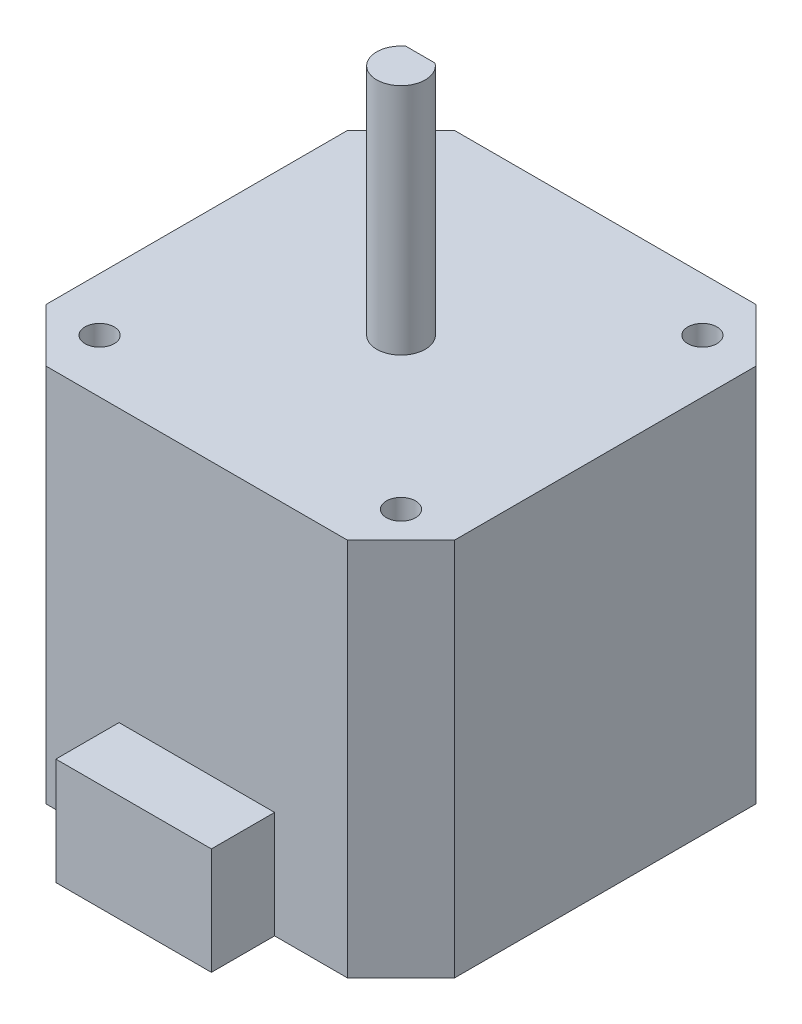
ISO-10303-21;
HEADER;
FILE_DESCRIPTION(('STEP AP214'),'2;1');
FILE_NAME('part.step','',(''),(''),'','','');
FILE_SCHEMA(('AUTOMOTIVE_DESIGN { 1 0 10303 214 1 1 1 1 }'));
ENDSEC;
DATA;
#1=APPLICATION_CONTEXT('core data for automotive mechanical design processes');
#2=APPLICATION_PROTOCOL_DEFINITION('international standard','automotive_design',2000,#1);
#3=PRODUCT_CONTEXT('',#1,'mechanical');
#4=PRODUCT('Part','Part','',(#3));
#5=PRODUCT_RELATED_PRODUCT_CATEGORY('part','',(#4));
#6=PRODUCT_DEFINITION_FORMATION('','',#4);
#7=PRODUCT_DEFINITION_CONTEXT('part definition',#1,'design');
#8=PRODUCT_DEFINITION('design','',#6,#7);
#9=PRODUCT_DEFINITION_SHAPE('','',#8);
#10=(LENGTH_UNIT() NAMED_UNIT(*) SI_UNIT(.MILLI.,.METRE.));
#11=(NAMED_UNIT(*) PLANE_ANGLE_UNIT() SI_UNIT($,.RADIAN.));
#12=(NAMED_UNIT(*) SI_UNIT($,.STERADIAN.) SOLID_ANGLE_UNIT());
#13=UNCERTAINTY_MEASURE_WITH_UNIT(LENGTH_MEASURE(1.E-05),#10,'distance_accuracy_value','');
#14=(GEOMETRIC_REPRESENTATION_CONTEXT(3) GLOBAL_UNCERTAINTY_ASSIGNED_CONTEXT((#13)) GLOBAL_UNIT_ASSIGNED_CONTEXT((#10,
#11,#12)) REPRESENTATION_CONTEXT('',''));
#15=CARTESIAN_POINT('',(0.,0.,0.));
#16=DIRECTION('',(0.,0.,1.));
#17=DIRECTION('',(1.,0.,0.));
#18=AXIS2_PLACEMENT_3D('',#15,#16,#17);
#19=CARTESIAN_POINT('',(-15.5,39.,21.));
#20=DIRECTION('',(0.,0.,-1.));
#21=DIRECTION('',(-1.,0.,0.));
#22=AXIS2_PLACEMENT_3D('',#19,#20,#21);
#23=PLANE('',#22);
#24=DIRECTION('',(0.,-1.,0.));
#25=VECTOR('',#24,1.);
#26=CARTESIAN_POINT('',(-8.,0.,21.));
#27=LINE('',#26,#25);
#28=CARTESIAN_POINT('',(-8.,11.,21.));
#29=VERTEX_POINT('',#28);
#30=CARTESIAN_POINT('',(-8.,0.,21.));
#31=VERTEX_POINT('',#30);
#32=EDGE_CURVE('E64',#29,#31,#27,.T.);
#33=ORIENTED_EDGE('',*,*,#32,.F.);
#34=DIRECTION('',(-1.,0.,0.));
#35=VECTOR('',#34,1.);
#36=CARTESIAN_POINT('',(-8.,11.,21.));
#37=LINE('',#36,#35);
#38=CARTESIAN_POINT('',(8.,11.,21.));
#39=VERTEX_POINT('',#38);
#40=EDGE_CURVE('E170',#39,#29,#37,.T.);
#41=ORIENTED_EDGE('',*,*,#40,.F.);
#42=DIRECTION('',(0.,1.,0.));
#43=VECTOR('',#42,1.);
#44=CARTESIAN_POINT('',(8.,0.,21.));
#45=LINE('',#44,#43);
#46=CARTESIAN_POINT('',(8.,0.,21.));
#47=VERTEX_POINT('',#46);
#48=EDGE_CURVE('E70',#47,#39,#45,.T.);
#49=ORIENTED_EDGE('',*,*,#48,.F.);
#50=DIRECTION('',(1.,0.,0.));
#51=VECTOR('',#50,1.);
#52=CARTESIAN_POINT('',(-15.5,0.,21.));
#53=LINE('',#52,#51);
#54=CARTESIAN_POINT('',(15.5,0.,21.));
#55=VERTEX_POINT('',#54);
#56=EDGE_CURVE('E242',#47,#55,#53,.T.);
#57=ORIENTED_EDGE('',*,*,#56,.T.);
#58=DIRECTION('',(0.,-1.,0.));
#59=VECTOR('',#58,1.);
#60=CARTESIAN_POINT('',(15.5,39.,21.));
#61=LINE('',#60,#59);
#62=CARTESIAN_POINT('',(15.5,39.,21.));
#63=VERTEX_POINT('',#62);
#64=EDGE_CURVE('E268',#63,#55,#61,.T.);
#65=ORIENTED_EDGE('',*,*,#64,.F.);
#66=DIRECTION('',(1.,0.,0.));
#67=VECTOR('',#66,1.);
#68=CARTESIAN_POINT('',(-15.5,39.,21.));
#69=LINE('',#68,#67);
#70=CARTESIAN_POINT('',(-15.5,39.,21.));
#71=VERTEX_POINT('',#70);
#72=EDGE_CURVE('E225',#71,#63,#69,.T.);
#73=ORIENTED_EDGE('',*,*,#72,.F.);
#74=DIRECTION('',(0.,-1.,0.));
#75=VECTOR('',#74,1.);
#76=CARTESIAN_POINT('',(-15.5,39.,21.));
#77=LINE('',#76,#75);
#78=CARTESIAN_POINT('',(-15.5,0.,21.));
#79=VERTEX_POINT('',#78);
#80=EDGE_CURVE('E271',#71,#79,#77,.T.);
#81=ORIENTED_EDGE('',*,*,#80,.T.);
#82=EDGE_CURVE('E243',#79,#31,#53,.T.);
#83=ORIENTED_EDGE('',*,*,#82,.T.);
#84=EDGE_LOOP('',(#33,#41,#49,#57,#65,#73,#81,#83));
#85=FACE_BOUND('',#84,.T.);
#86=ADVANCED_FACE('F49',(#85),#23,.F.);
#87=CARTESIAN_POINT('',(-21.,39.,15.5));
#88=DIRECTION('',(1.,0.,0.));
#89=DIRECTION('',(0.,0.,-1.));
#90=AXIS2_PLACEMENT_3D('',#87,#88,#89);
#91=PLANE('',#90);
#92=DIRECTION('',(0.,0.,1.));
#93=VECTOR('',#92,1.);
#94=CARTESIAN_POINT('',(-21.,0.,15.5));
#95=LINE('',#94,#93);
#96=CARTESIAN_POINT('',(-21.,0.,-15.5));
#97=VERTEX_POINT('',#96);
#98=CARTESIAN_POINT('',(-21.,0.,15.5));
#99=VERTEX_POINT('',#98);
#100=EDGE_CURVE('E218',#97,#99,#95,.T.);
#101=ORIENTED_EDGE('',*,*,#100,.T.);
#102=DIRECTION('',(0.,-1.,0.));
#103=VECTOR('',#102,1.);
#104=CARTESIAN_POINT('',(-21.,39.,15.5));
#105=LINE('',#104,#103);
#106=CARTESIAN_POINT('',(-21.,39.,15.5));
#107=VERTEX_POINT('',#106);
#108=EDGE_CURVE('E57',#107,#99,#105,.T.);
#109=ORIENTED_EDGE('',*,*,#108,.F.);
#110=DIRECTION('',(0.,0.,1.));
#111=VECTOR('',#110,1.);
#112=CARTESIAN_POINT('',(-21.,39.,15.5));
#113=LINE('',#112,#111);
#114=CARTESIAN_POINT('',(-21.,39.,-15.5));
#115=VERTEX_POINT('',#114);
#116=EDGE_CURVE('E219',#115,#107,#113,.T.);
#117=ORIENTED_EDGE('',*,*,#116,.F.);
#118=DIRECTION('',(0.,-1.,0.));
#119=VECTOR('',#118,1.);
#120=CARTESIAN_POINT('',(-21.,39.,-15.5));
#121=LINE('',#120,#119);
#122=EDGE_CURVE('E237',#115,#97,#121,.T.);
#123=ORIENTED_EDGE('',*,*,#122,.T.);
#124=EDGE_LOOP('',(#101,#109,#117,#123));
#125=FACE_BOUND('',#124,.T.);
#126=ADVANCED_FACE('F51',(#125),#91,.F.);
#127=CARTESIAN_POINT('',(-21.,39.,15.5));
#128=DIRECTION('',(0.707106781186549,0.,-0.707106781186546));
#129=DIRECTION('',(-0.707106781186546,0.,-0.707106781186549));
#130=AXIS2_PLACEMENT_3D('',#127,#128,#129);
#131=PLANE('',#130);
#132=DIRECTION('',(0.707106781186546,0.,0.707106781186549));
#133=VECTOR('',#132,1.);
#134=CARTESIAN_POINT('',(-21.,0.,15.5));
#135=LINE('',#134,#133);
#136=EDGE_CURVE('E240',#99,#79,#135,.T.);
#137=ORIENTED_EDGE('',*,*,#136,.T.);
#138=ORIENTED_EDGE('',*,*,#80,.F.);
#139=DIRECTION('',(0.707106781186546,0.,0.707106781186549));
#140=VECTOR('',#139,1.);
#141=CARTESIAN_POINT('',(-21.,39.,15.5));
#142=LINE('',#141,#140);
#143=EDGE_CURVE('E222',#107,#71,#142,.T.);
#144=ORIENTED_EDGE('',*,*,#143,.F.);
#145=ORIENTED_EDGE('',*,*,#108,.T.);
#146=EDGE_LOOP('',(#137,#138,#144,#145));
#147=FACE_BOUND('',#146,.T.);
#148=ADVANCED_FACE('F276',(#147),#131,.F.);
#149=CARTESIAN_POINT('',(15.5,39.,21.));
#150=DIRECTION('',(-0.707106781186549,0.,-0.707106781186546));
#151=DIRECTION('',(-0.707106781186546,0.,0.707106781186549));
#152=AXIS2_PLACEMENT_3D('',#149,#150,#151);
#153=PLANE('',#152);
#154=DIRECTION('',(0.707106781186546,0.,-0.707106781186549));
#155=VECTOR('',#154,1.);
#156=CARTESIAN_POINT('',(15.5,0.,21.));
#157=LINE('',#156,#155);
#158=CARTESIAN_POINT('',(21.,0.,15.5));
#159=VERTEX_POINT('',#158);
#160=EDGE_CURVE('E245',#55,#159,#157,.T.);
#161=ORIENTED_EDGE('',*,*,#160,.T.);
#162=DIRECTION('',(0.,-1.,0.));
#163=VECTOR('',#162,1.);
#164=CARTESIAN_POINT('',(21.,39.,15.5));
#165=LINE('',#164,#163);
#166=CARTESIAN_POINT('',(21.,39.,15.5));
#167=VERTEX_POINT('',#166);
#168=EDGE_CURVE('E265',#167,#159,#165,.T.);
#169=ORIENTED_EDGE('',*,*,#168,.F.);
#170=DIRECTION('',(0.707106781186546,0.,-0.707106781186549));
#171=VECTOR('',#170,1.);
#172=CARTESIAN_POINT('',(15.5,39.,21.));
#173=LINE('',#172,#171);
#174=EDGE_CURVE('E227',#63,#167,#173,.T.);
#175=ORIENTED_EDGE('',*,*,#174,.F.);
#176=ORIENTED_EDGE('',*,*,#64,.T.);
#177=EDGE_LOOP('',(#161,#169,#175,#176));
#178=FACE_BOUND('',#177,.T.);
#179=ADVANCED_FACE('F308',(#178),#153,.F.);
#180=CARTESIAN_POINT('',(21.,39.,15.5));
#181=DIRECTION('',(-1.,0.,0.));
#182=DIRECTION('',(0.,0.,1.));
#183=AXIS2_PLACEMENT_3D('',#180,#181,#182);
#184=PLANE('',#183);
#185=DIRECTION('',(0.,0.,-1.));
#186=VECTOR('',#185,1.);
#187=CARTESIAN_POINT('',(21.,0.,15.5));
#188=LINE('',#187,#186);
#189=CARTESIAN_POINT('',(21.,0.,-15.5));
#190=VERTEX_POINT('',#189);
#191=EDGE_CURVE('E247',#159,#190,#188,.T.);
#192=ORIENTED_EDGE('',*,*,#191,.T.);
#193=DIRECTION('',(0.,-1.,0.));
#194=VECTOR('',#193,1.);
#195=CARTESIAN_POINT('',(21.,39.,-15.5));
#196=LINE('',#195,#194);
#197=CARTESIAN_POINT('',(21.,39.,-15.5));
#198=VERTEX_POINT('',#197);
#199=EDGE_CURVE('E262',#198,#190,#196,.T.);
#200=ORIENTED_EDGE('',*,*,#199,.F.);
#201=DIRECTION('',(0.,0.,-1.));
#202=VECTOR('',#201,1.);
#203=CARTESIAN_POINT('',(21.,39.,15.5));
#204=LINE('',#203,#202);
#205=EDGE_CURVE('E229',#167,#198,#204,.T.);
#206=ORIENTED_EDGE('',*,*,#205,.F.);
#207=ORIENTED_EDGE('',*,*,#168,.T.);
#208=EDGE_LOOP('',(#192,#200,#206,#207));
#209=FACE_BOUND('',#208,.T.);
#210=ADVANCED_FACE('F306',(#209),#184,.F.);
#211=CARTESIAN_POINT('',(15.5,39.,-21.));
#212=DIRECTION('',(-0.707106781186549,0.,0.707106781186546));
#213=DIRECTION('',(0.707106781186546,0.,0.707106781186549));
#214=AXIS2_PLACEMENT_3D('',#211,#212,#213);
#215=PLANE('',#214);
#216=DIRECTION('',(-0.707106781186546,0.,-0.707106781186549));
#217=VECTOR('',#216,1.);
#218=CARTESIAN_POINT('',(15.5,0.,-21.));
#219=LINE('',#218,#217);
#220=CARTESIAN_POINT('',(15.5,0.,-21.));
#221=VERTEX_POINT('',#220);
#222=EDGE_CURVE('E249',#190,#221,#219,.T.);
#223=ORIENTED_EDGE('',*,*,#222,.T.);
#224=DIRECTION('',(0.,-1.,0.));
#225=VECTOR('',#224,1.);
#226=CARTESIAN_POINT('',(15.5,39.,-21.));
#227=LINE('',#226,#225);
#228=CARTESIAN_POINT('',(15.5,39.,-21.));
#229=VERTEX_POINT('',#228);
#230=EDGE_CURVE('E259',#229,#221,#227,.T.);
#231=ORIENTED_EDGE('',*,*,#230,.F.);
#232=DIRECTION('',(-0.707106781186546,0.,-0.707106781186549));
#233=VECTOR('',#232,1.);
#234=CARTESIAN_POINT('',(15.5,39.,-21.));
#235=LINE('',#234,#233);
#236=EDGE_CURVE('E231',#198,#229,#235,.T.);
#237=ORIENTED_EDGE('',*,*,#236,.F.);
#238=ORIENTED_EDGE('',*,*,#199,.T.);
#239=EDGE_LOOP('',(#223,#231,#237,#238));
#240=FACE_BOUND('',#239,.T.);
#241=ADVANCED_FACE('F301',(#240),#215,.F.);
#242=CARTESIAN_POINT('',(-15.5,39.,-21.));
#243=DIRECTION('',(0.,0.,1.));
#244=DIRECTION('',(1.,0.,0.));
#245=AXIS2_PLACEMENT_3D('',#242,#243,#244);
#246=PLANE('',#245);
#247=DIRECTION('',(-1.,0.,0.));
#248=VECTOR('',#247,1.);
#249=CARTESIAN_POINT('',(-15.5,0.,-21.));
#250=LINE('',#249,#248);
#251=CARTESIAN_POINT('',(-15.5,0.,-21.));
#252=VERTEX_POINT('',#251);
#253=EDGE_CURVE('E251',#221,#252,#250,.T.);
#254=ORIENTED_EDGE('',*,*,#253,.T.);
#255=DIRECTION('',(0.,-1.,0.));
#256=VECTOR('',#255,1.);
#257=CARTESIAN_POINT('',(-15.5,39.,-21.));
#258=LINE('',#257,#256);
#259=CARTESIAN_POINT('',(-15.5,39.,-21.));
#260=VERTEX_POINT('',#259);
#261=EDGE_CURVE('E256',#260,#252,#258,.T.);
#262=ORIENTED_EDGE('',*,*,#261,.F.);
#263=DIRECTION('',(-1.,0.,0.));
#264=VECTOR('',#263,1.);
#265=CARTESIAN_POINT('',(-15.5,39.,-21.));
#266=LINE('',#265,#264);
#267=EDGE_CURVE('E233',#229,#260,#266,.T.);
#268=ORIENTED_EDGE('',*,*,#267,.F.);
#269=ORIENTED_EDGE('',*,*,#230,.T.);
#270=EDGE_LOOP('',(#254,#262,#268,#269));
#271=FACE_BOUND('',#270,.T.);
#272=ADVANCED_FACE('F295',(#271),#246,.F.);
#273=CARTESIAN_POINT('',(-21.,39.,-15.5));
#274=DIRECTION('',(0.707106781186549,0.,0.707106781186546));
#275=DIRECTION('',(0.707106781186546,0.,-0.707106781186549));
#276=AXIS2_PLACEMENT_3D('',#273,#274,#275);
#277=PLANE('',#276);
#278=DIRECTION('',(-0.707106781186546,0.,0.707106781186549));
#279=VECTOR('',#278,1.);
#280=CARTESIAN_POINT('',(-21.,0.,-15.5));
#281=LINE('',#280,#279);
#282=EDGE_CURVE('E223',#252,#97,#281,.T.);
#283=ORIENTED_EDGE('',*,*,#282,.T.);
#284=ORIENTED_EDGE('',*,*,#122,.F.);
#285=DIRECTION('',(-0.707106781186546,0.,0.707106781186549));
#286=VECTOR('',#285,1.);
#287=CARTESIAN_POINT('',(-21.,39.,-15.5));
#288=LINE('',#287,#286);
#289=EDGE_CURVE('E235',#260,#115,#288,.T.);
#290=ORIENTED_EDGE('',*,*,#289,.F.);
#291=ORIENTED_EDGE('',*,*,#261,.T.);
#292=EDGE_LOOP('',(#283,#284,#290,#291));
#293=FACE_BOUND('',#292,.T.);
#294=ADVANCED_FACE('F293',(#293),#277,.F.);
#295=CARTESIAN_POINT('',(0.,39.,0.));
#296=DIRECTION('',(0.,-1.,0.));
#297=DIRECTION('',(0.,0.,-1.));
#298=AXIS2_PLACEMENT_3D('',#295,#296,#297);
#299=PLANE('',#298);
#300=CARTESIAN_POINT('',(-15.5,39.,15.4999999999999));
#301=DIRECTION('',(0.,1.,0.));
#302=DIRECTION('',(0.,0.,1.));
#303=AXIS2_PLACEMENT_3D('',#300,#301,#302);
#304=CIRCLE('',#303,1.5);
#305=CARTESIAN_POINT('',(-15.5,39.,16.9999999999999));
#306=VERTEX_POINT('',#305);
#307=EDGE_CURVE('E176',#306,#306,#304,.T.);
#308=ORIENTED_EDGE('',*,*,#307,.F.);
#309=EDGE_LOOP('',(#308));
#310=FACE_BOUND('',#309,.T.);
#311=CARTESIAN_POINT('',(15.5,39.,15.4999999999999));
#312=DIRECTION('',(0.,1.,0.));
#313=DIRECTION('',(0.,0.,1.));
#314=AXIS2_PLACEMENT_3D('',#311,#312,#313);
#315=CIRCLE('',#314,1.5);
#316=CARTESIAN_POINT('',(15.5,39.,16.9999999999999));
#317=VERTEX_POINT('',#316);
#318=EDGE_CURVE('E189',#317,#317,#315,.T.);
#319=ORIENTED_EDGE('',*,*,#318,.F.);
#320=EDGE_LOOP('',(#319));
#321=FACE_BOUND('',#320,.T.);
#322=CARTESIAN_POINT('',(15.5,39.,-15.5));
#323=DIRECTION('',(0.,1.,0.));
#324=DIRECTION('',(0.,0.,1.));
#325=AXIS2_PLACEMENT_3D('',#322,#323,#324);
#326=CIRCLE('',#325,1.5);
#327=CARTESIAN_POINT('',(15.5,39.,-14.));
#328=VERTEX_POINT('',#327);
#329=EDGE_CURVE('E182',#328,#328,#326,.T.);
#330=ORIENTED_EDGE('',*,*,#329,.F.);
#331=EDGE_LOOP('',(#330));
#332=FACE_BOUND('',#331,.T.);
#333=CARTESIAN_POINT('',(-15.5,39.,-15.5));
#334=DIRECTION('',(0.,1.,0.));
#335=DIRECTION('',(0.,0.,1.));
#336=AXIS2_PLACEMENT_3D('',#333,#334,#335);
#337=CIRCLE('',#336,1.5);
#338=CARTESIAN_POINT('',(-15.5,39.,-14.));
#339=VERTEX_POINT('',#338);
#340=EDGE_CURVE('E185',#339,#339,#337,.T.);
#341=ORIENTED_EDGE('',*,*,#340,.F.);
#342=EDGE_LOOP('',(#341));
#343=FACE_BOUND('',#342,.T.);
#344=CARTESIAN_POINT('',(0.,39.,0.));
#345=DIRECTION('',(0.,-1.,0.));
#346=DIRECTION('',(0.,0.,-1.));
#347=AXIS2_PLACEMENT_3D('',#344,#345,#346);
#348=CIRCLE('',#347,2.5);
#349=CARTESIAN_POINT('',(0.,39.,-2.5));
#350=VERTEX_POINT('',#349);
#351=EDGE_CURVE('E11',#350,#350,#348,.F.);
#352=ORIENTED_EDGE('',*,*,#351,.F.);
#353=EDGE_LOOP('',(#352));
#354=FACE_BOUND('',#353,.T.);
#355=ORIENTED_EDGE('',*,*,#116,.T.);
#356=ORIENTED_EDGE('',*,*,#143,.T.);
#357=ORIENTED_EDGE('',*,*,#72,.T.);
#358=ORIENTED_EDGE('',*,*,#174,.T.);
#359=ORIENTED_EDGE('',*,*,#205,.T.);
#360=ORIENTED_EDGE('',*,*,#236,.T.);
#361=ORIENTED_EDGE('',*,*,#267,.T.);
#362=ORIENTED_EDGE('',*,*,#289,.T.);
#363=EDGE_LOOP('',(#355,#356,#357,#358,#359,#360,#361,#362));
#364=FACE_BOUND('',#363,.T.);
#365=ADVANCED_FACE('F287',(#310,#321,#332,#343,#354,#364),#299,.F.);
#366=CARTESIAN_POINT('',(0.,0.,0.));
#367=DIRECTION('',(0.,-1.,0.));
#368=DIRECTION('',(0.,0.,-1.));
#369=AXIS2_PLACEMENT_3D('',#366,#367,#368);
#370=PLANE('',#369);
#371=ORIENTED_EDGE('',*,*,#100,.F.);
#372=ORIENTED_EDGE('',*,*,#282,.F.);
#373=ORIENTED_EDGE('',*,*,#253,.F.);
#374=ORIENTED_EDGE('',*,*,#222,.F.);
#375=ORIENTED_EDGE('',*,*,#191,.F.);
#376=ORIENTED_EDGE('',*,*,#160,.F.);
#377=ORIENTED_EDGE('',*,*,#56,.F.);
#378=DIRECTION('',(0.,0.,-1.));
#379=VECTOR('',#378,1.);
#380=CARTESIAN_POINT('',(8.,0.,27.5));
#381=LINE('',#380,#379);
#382=CARTESIAN_POINT('',(8.,0.,27.5));
#383=VERTEX_POINT('',#382);
#384=EDGE_CURVE('E157',#383,#47,#381,.T.);
#385=ORIENTED_EDGE('',*,*,#384,.F.);
#386=DIRECTION('',(1.,0.,0.));
#387=VECTOR('',#386,1.);
#388=CARTESIAN_POINT('',(-8.,0.,27.5));
#389=LINE('',#388,#387);
#390=CARTESIAN_POINT('',(-8.,0.,27.5));
#391=VERTEX_POINT('',#390);
#392=EDGE_CURVE('E149',#391,#383,#389,.T.);
#393=ORIENTED_EDGE('',*,*,#392,.F.);
#394=DIRECTION('',(0.,0.,-1.));
#395=VECTOR('',#394,1.);
#396=CARTESIAN_POINT('',(-8.,0.,27.5));
#397=LINE('',#396,#395);
#398=EDGE_CURVE('E155',#391,#31,#397,.T.);
#399=ORIENTED_EDGE('',*,*,#398,.T.);
#400=ORIENTED_EDGE('',*,*,#82,.F.);
#401=ORIENTED_EDGE('',*,*,#136,.F.);
#402=EDGE_LOOP('',(#371,#372,#373,#374,#375,#376,#377,#385,#393,#399,#400,#401));
#403=FACE_BOUND('',#402,.T.);
#404=ADVANCED_FACE('F152',(#403),#370,.T.);
#405=CARTESIAN_POINT('',(0.,48.,0.));
#406=DIRECTION('',(0.,-1.,0.));
#407=DIRECTION('',(0.,0.,-1.));
#408=AXIS2_PLACEMENT_3D('',#405,#406,#407);
#409=CYLINDRICAL_SURFACE('',#408,2.5);
#410=CARTESIAN_POINT('',(0.,48.,0.));
#411=DIRECTION('',(0.,1.,0.));
#412=DIRECTION('',(0.,0.,1.));
#413=AXIS2_PLACEMENT_3D('',#410,#411,#412);
#414=CIRCLE('',#413,2.5);
#415=CARTESIAN_POINT('',(1.5,48.,-2.));
#416=VERTEX_POINT('',#415);
#417=CARTESIAN_POINT('',(-1.5,48.,-2.));
#418=VERTEX_POINT('',#417);
#419=EDGE_CURVE('E216',#416,#418,#414,.T.);
#420=ORIENTED_EDGE('',*,*,#419,.F.);
#421=DIRECTION('',(0.,-1.,0.));
#422=VECTOR('',#421,1.);
#423=CARTESIAN_POINT('',(1.5,63.,-2.));
#424=LINE('',#423,#422);
#425=CARTESIAN_POINT('',(1.5,63.,-2.));
#426=VERTEX_POINT('',#425);
#427=EDGE_CURVE('E213',#426,#416,#424,.T.);
#428=ORIENTED_EDGE('',*,*,#427,.F.);
#429=CARTESIAN_POINT('',(0.,63.,0.));
#430=DIRECTION('',(0.,1.,0.));
#431=DIRECTION('',(0.,0.,1.));
#432=AXIS2_PLACEMENT_3D('',#429,#430,#431);
#433=CIRCLE('',#432,2.5);
#434=CARTESIAN_POINT('',(-1.5,63.,-2.));
#435=VERTEX_POINT('',#434);
#436=EDGE_CURVE('E203',#435,#426,#433,.T.);
#437=ORIENTED_EDGE('',*,*,#436,.F.);
#438=DIRECTION('',(0.,-1.,0.));
#439=VECTOR('',#438,1.);
#440=CARTESIAN_POINT('',(-1.5,63.,-2.));
#441=LINE('',#440,#439);
#442=EDGE_CURVE('E208',#435,#418,#441,.T.);
#443=ORIENTED_EDGE('',*,*,#442,.T.);
#444=EDGE_LOOP('',(#420,#428,#437,#443));
#445=FACE_BOUND('',#444,.T.);
#446=ORIENTED_EDGE('',*,*,#351,.T.);
#447=EDGE_LOOP('',(#446));
#448=FACE_BOUND('',#447,.T.);
#449=ADVANCED_FACE('F356',(#445,#448),#409,.T.);
#450=CARTESIAN_POINT('',(0.,48.,0.));
#451=DIRECTION('',(0.,1.,0.));
#452=DIRECTION('',(0.,0.,1.));
#453=AXIS2_PLACEMENT_3D('',#450,#451,#452);
#454=PLANE('',#453);
#455=DIRECTION('',(-1.,0.,0.));
#456=VECTOR('',#455,1.);
#457=CARTESIAN_POINT('',(-1.5,48.,-2.));
#458=LINE('',#457,#456);
#459=EDGE_CURVE('E200',#416,#418,#458,.T.);
#460=ORIENTED_EDGE('',*,*,#459,.F.);
#461=ORIENTED_EDGE('',*,*,#419,.T.);
#462=EDGE_LOOP('',(#460,#461));
#463=FACE_BOUND('',#462,.T.);
#464=ADVANCED_FACE('F362',(#463),#454,.T.);
#465=CARTESIAN_POINT('',(-1.5,63.,-2.));
#466=DIRECTION('',(0.,0.,1.));
#467=DIRECTION('',(1.,0.,0.));
#468=AXIS2_PLACEMENT_3D('',#465,#466,#467);
#469=PLANE('',#468);
#470=ORIENTED_EDGE('',*,*,#459,.T.);
#471=ORIENTED_EDGE('',*,*,#442,.F.);
#472=DIRECTION('',(-1.,0.,0.));
#473=VECTOR('',#472,1.);
#474=CARTESIAN_POINT('',(-1.5,63.,-2.));
#475=LINE('',#474,#473);
#476=EDGE_CURVE('E206',#426,#435,#475,.T.);
#477=ORIENTED_EDGE('',*,*,#476,.F.);
#478=ORIENTED_EDGE('',*,*,#427,.T.);
#479=EDGE_LOOP('',(#470,#471,#477,#478));
#480=FACE_BOUND('',#479,.T.);
#481=ADVANCED_FACE('F366',(#480),#469,.F.);
#482=CARTESIAN_POINT('',(0.,63.,0.));
#483=DIRECTION('',(0.,1.,0.));
#484=DIRECTION('',(0.,0.,1.));
#485=AXIS2_PLACEMENT_3D('',#482,#483,#484);
#486=PLANE('',#485);
#487=ORIENTED_EDGE('',*,*,#436,.T.);
#488=ORIENTED_EDGE('',*,*,#476,.T.);
#489=EDGE_LOOP('',(#487,#488));
#490=FACE_BOUND('',#489,.T.);
#491=ADVANCED_FACE('F370',(#490),#486,.T.);
#492=CARTESIAN_POINT('',(-15.5,34.5,-15.5));
#493=DIRECTION('',(0.,1.,0.));
#494=DIRECTION('',(0.,0.,1.));
#495=AXIS2_PLACEMENT_3D('',#492,#493,#494);
#496=CYLINDRICAL_SURFACE('',#495,1.5);
#497=CARTESIAN_POINT('',(-15.5,34.5,-15.5));
#498=DIRECTION('',(0.,1.,0.));
#499=DIRECTION('',(0.,0.,1.));
#500=AXIS2_PLACEMENT_3D('',#497,#498,#499);
#501=CIRCLE('',#500,1.5);
#502=CARTESIAN_POINT('',(-15.5,34.5,-14.));
#503=VERTEX_POINT('',#502);
#504=EDGE_CURVE('E197',#503,#503,#501,.T.);
#505=ORIENTED_EDGE('',*,*,#504,.F.);
#506=EDGE_LOOP('',(#505));
#507=FACE_BOUND('',#506,.T.);
#508=ORIENTED_EDGE('',*,*,#340,.T.);
#509=EDGE_LOOP('',(#508));
#510=FACE_BOUND('',#509,.T.);
#511=ADVANCED_FACE('F374',(#507,#510),#496,.F.);
#512=CARTESIAN_POINT('',(-15.5,34.5,-15.5));
#513=DIRECTION('',(0.,1.,0.));
#514=DIRECTION('',(0.,0.,1.));
#515=AXIS2_PLACEMENT_3D('',#512,#513,#514);
#516=PLANE('',#515);
#517=ORIENTED_EDGE('',*,*,#504,.T.);
#518=EDGE_LOOP('',(#517));
#519=FACE_BOUND('',#518,.T.);
#520=ADVANCED_FACE('F378',(#519),#516,.T.);
#521=CARTESIAN_POINT('',(15.5,34.5,-15.5));
#522=DIRECTION('',(0.,1.,0.));
#523=DIRECTION('',(0.,0.,1.));
#524=AXIS2_PLACEMENT_3D('',#521,#522,#523);
#525=CYLINDRICAL_SURFACE('',#524,1.5);
#526=CARTESIAN_POINT('',(15.5,34.5,-15.5));
#527=DIRECTION('',(0.,1.,0.));
#528=DIRECTION('',(0.,0.,1.));
#529=AXIS2_PLACEMENT_3D('',#526,#527,#528);
#530=CIRCLE('',#529,1.5);
#531=CARTESIAN_POINT('',(15.5,34.5,-14.));
#532=VERTEX_POINT('',#531);
#533=EDGE_CURVE('E186',#532,#532,#530,.T.);
#534=ORIENTED_EDGE('',*,*,#533,.F.);
#535=EDGE_LOOP('',(#534));
#536=FACE_BOUND('',#535,.T.);
#537=ORIENTED_EDGE('',*,*,#329,.T.);
#538=EDGE_LOOP('',(#537));
#539=FACE_BOUND('',#538,.T.);
#540=ADVANCED_FACE('F382',(#536,#539),#525,.F.);
#541=CARTESIAN_POINT('',(15.5,34.5,-15.5));
#542=DIRECTION('',(0.,1.,0.));
#543=DIRECTION('',(0.,0.,1.));
#544=AXIS2_PLACEMENT_3D('',#541,#542,#543);
#545=PLANE('',#544);
#546=ORIENTED_EDGE('',*,*,#533,.T.);
#547=EDGE_LOOP('',(#546));
#548=FACE_BOUND('',#547,.T.);
#549=ADVANCED_FACE('F398',(#548),#545,.T.);
#550=CARTESIAN_POINT('',(15.5,34.5,15.4999999999999));
#551=DIRECTION('',(0.,1.,0.));
#552=DIRECTION('',(0.,0.,1.));
#553=AXIS2_PLACEMENT_3D('',#550,#551,#552);
#554=CYLINDRICAL_SURFACE('',#553,1.5);
#555=CARTESIAN_POINT('',(15.5,34.5,15.4999999999999));
#556=DIRECTION('',(0.,1.,0.));
#557=DIRECTION('',(0.,0.,1.));
#558=AXIS2_PLACEMENT_3D('',#555,#556,#557);
#559=CIRCLE('',#558,1.5);
#560=CARTESIAN_POINT('',(15.5,34.5,16.9999999999999));
#561=VERTEX_POINT('',#560);
#562=EDGE_CURVE('E192',#561,#561,#559,.T.);
#563=ORIENTED_EDGE('',*,*,#562,.F.);
#564=EDGE_LOOP('',(#563));
#565=FACE_BOUND('',#564,.T.);
#566=ORIENTED_EDGE('',*,*,#318,.T.);
#567=EDGE_LOOP('',(#566));
#568=FACE_BOUND('',#567,.T.);
#569=ADVANCED_FACE('F394',(#565,#568),#554,.F.);
#570=CARTESIAN_POINT('',(15.5,34.5,15.4999999999999));
#571=DIRECTION('',(0.,1.,0.));
#572=DIRECTION('',(0.,0.,1.));
#573=AXIS2_PLACEMENT_3D('',#570,#571,#572);
#574=PLANE('',#573);
#575=ORIENTED_EDGE('',*,*,#562,.T.);
#576=EDGE_LOOP('',(#575));
#577=FACE_BOUND('',#576,.T.);
#578=ADVANCED_FACE('F390',(#577),#574,.T.);
#579=CARTESIAN_POINT('',(-15.5,34.5,15.4999999999999));
#580=DIRECTION('',(0.,1.,0.));
#581=DIRECTION('',(0.,0.,1.));
#582=AXIS2_PLACEMENT_3D('',#579,#580,#581);
#583=CYLINDRICAL_SURFACE('',#582,1.5);
#584=CARTESIAN_POINT('',(-15.5,34.5,15.4999999999999));
#585=DIRECTION('',(0.,1.,0.));
#586=DIRECTION('',(0.,0.,1.));
#587=AXIS2_PLACEMENT_3D('',#584,#585,#586);
#588=CIRCLE('',#587,1.5);
#589=CARTESIAN_POINT('',(-15.5,34.5,16.9999999999999));
#590=VERTEX_POINT('',#589);
#591=EDGE_CURVE('E173',#590,#590,#588,.T.);
#592=ORIENTED_EDGE('',*,*,#591,.F.);
#593=EDGE_LOOP('',(#592));
#594=FACE_BOUND('',#593,.T.);
#595=ORIENTED_EDGE('',*,*,#307,.T.);
#596=EDGE_LOOP('',(#595));
#597=FACE_BOUND('',#596,.T.);
#598=ADVANCED_FACE('F386',(#594,#597),#583,.F.);
#599=CARTESIAN_POINT('',(-15.5,34.5,15.4999999999999));
#600=DIRECTION('',(0.,1.,0.));
#601=DIRECTION('',(0.,0.,1.));
#602=AXIS2_PLACEMENT_3D('',#599,#600,#601);
#603=PLANE('',#602);
#604=ORIENTED_EDGE('',*,*,#591,.T.);
#605=EDGE_LOOP('',(#604));
#606=FACE_BOUND('',#605,.T.);
#607=ADVANCED_FACE('F384',(#606),#603,.T.);
#608=CARTESIAN_POINT('',(-8.,0.,27.5));
#609=DIRECTION('',(1.,0.,0.));
#610=DIRECTION('',(0.,0.,-1.));
#611=AXIS2_PLACEMENT_3D('',#608,#609,#610);
#612=PLANE('',#611);
#613=ORIENTED_EDGE('',*,*,#32,.T.);
#614=ORIENTED_EDGE('',*,*,#398,.F.);
#615=DIRECTION('',(0.,-1.,0.));
#616=VECTOR('',#615,1.);
#617=CARTESIAN_POINT('',(-8.,0.,27.5));
#618=LINE('',#617,#616);
#619=CARTESIAN_POINT('',(-8.,11.,27.5));
#620=VERTEX_POINT('',#619);
#621=EDGE_CURVE('E161',#620,#391,#618,.T.);
#622=ORIENTED_EDGE('',*,*,#621,.F.);
#623=DIRECTION('',(0.,0.,-1.));
#624=VECTOR('',#623,1.);
#625=CARTESIAN_POINT('',(-8.,11.,27.5));
#626=LINE('',#625,#624);
#627=EDGE_CURVE('E314',#620,#29,#626,.T.);
#628=ORIENTED_EDGE('',*,*,#627,.T.);
#629=EDGE_LOOP('',(#613,#614,#622,#628));
#630=FACE_BOUND('',#629,.T.);
#631=ADVANCED_FACE('F172',(#630),#612,.F.);
#632=CARTESIAN_POINT('',(8.,0.,27.5));
#633=DIRECTION('',(-1.,0.,0.));
#634=DIRECTION('',(0.,0.,1.));
#635=AXIS2_PLACEMENT_3D('',#632,#633,#634);
#636=PLANE('',#635);
#637=ORIENTED_EDGE('',*,*,#48,.T.);
#638=DIRECTION('',(0.,0.,-1.));
#639=VECTOR('',#638,1.);
#640=CARTESIAN_POINT('',(8.,11.,27.5));
#641=LINE('',#640,#639);
#642=CARTESIAN_POINT('',(8.,11.,27.5));
#643=VERTEX_POINT('',#642);
#644=EDGE_CURVE('E178',#643,#39,#641,.T.);
#645=ORIENTED_EDGE('',*,*,#644,.F.);
#646=DIRECTION('',(0.,1.,0.));
#647=VECTOR('',#646,1.);
#648=CARTESIAN_POINT('',(8.,0.,27.5));
#649=LINE('',#648,#647);
#650=EDGE_CURVE('E160',#383,#643,#649,.T.);
#651=ORIENTED_EDGE('',*,*,#650,.F.);
#652=ORIENTED_EDGE('',*,*,#384,.T.);
#653=EDGE_LOOP('',(#637,#645,#651,#652));
#654=FACE_BOUND('',#653,.T.);
#655=ADVANCED_FACE('F310',(#654),#636,.F.);
#656=CARTESIAN_POINT('',(-8.,11.,27.5));
#657=DIRECTION('',(0.,-1.,0.));
#658=DIRECTION('',(0.,0.,-1.));
#659=AXIS2_PLACEMENT_3D('',#656,#657,#658);
#660=PLANE('',#659);
#661=ORIENTED_EDGE('',*,*,#40,.T.);
#662=ORIENTED_EDGE('',*,*,#627,.F.);
#663=DIRECTION('',(-1.,0.,0.));
#664=VECTOR('',#663,1.);
#665=CARTESIAN_POINT('',(-8.,11.,27.5));
#666=LINE('',#665,#664);
#667=EDGE_CURVE('E166',#643,#620,#666,.T.);
#668=ORIENTED_EDGE('',*,*,#667,.F.);
#669=ORIENTED_EDGE('',*,*,#644,.T.);
#670=EDGE_LOOP('',(#661,#662,#668,#669));
#671=FACE_BOUND('',#670,.T.);
#672=ADVANCED_FACE('F321',(#671),#660,.F.);
#673=CARTESIAN_POINT('',(0.,0.,27.5));
#674=DIRECTION('',(0.,0.,-1.));
#675=DIRECTION('',(-1.,0.,0.));
#676=AXIS2_PLACEMENT_3D('',#673,#674,#675);
#677=PLANE('',#676);
#678=ORIENTED_EDGE('',*,*,#621,.T.);
#679=ORIENTED_EDGE('',*,*,#392,.T.);
#680=ORIENTED_EDGE('',*,*,#650,.T.);
#681=ORIENTED_EDGE('',*,*,#667,.T.);
#682=EDGE_LOOP('',(#678,#679,#680,#681));
#683=FACE_BOUND('',#682,.T.);
#684=ADVANCED_FACE('F164',(#683),#677,.F.);
#685=CLOSED_SHELL('',(#86,#126,#148,#179,#210,#241,#272,#294,#365,#404,#449,#464,#481,#491,#511,
#520,#540,#549,#569,#578,#598,#607,#631,#655,#672,#684));
#686=MANIFOLD_SOLID_BREP('B2',#685);
#687=ADVANCED_BREP_SHAPE_REPRESENTATION('',(#18,#686),#14);
#688=SHAPE_DEFINITION_REPRESENTATION(#9,#687);
ENDSEC;
END-ISO-10303-21;
